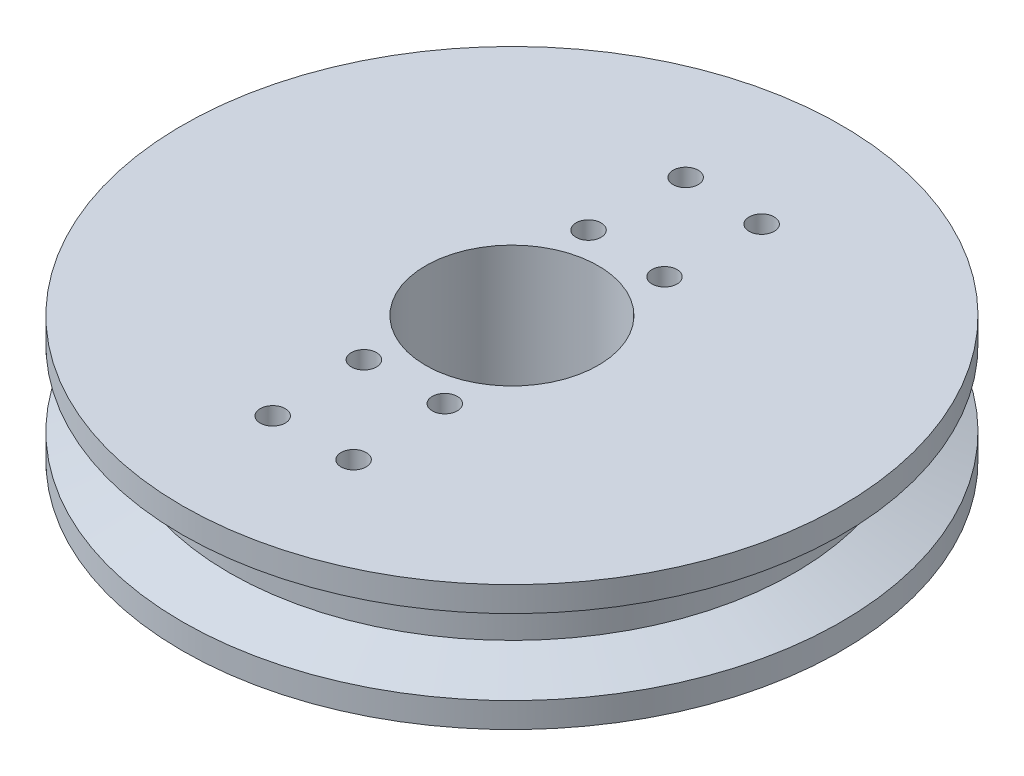
ISO-10303-21;
HEADER;
FILE_DESCRIPTION(('STEP AP214'),'2;1');
FILE_NAME('part.step','',(''),(''),'','','');
FILE_SCHEMA(('AUTOMOTIVE_DESIGN { 1 0 10303 214 1 1 1 1 }'));
ENDSEC;
DATA;
#1=APPLICATION_CONTEXT('core data for automotive mechanical design processes');
#2=APPLICATION_PROTOCOL_DEFINITION('international standard','automotive_design',2000,#1);
#3=PRODUCT_CONTEXT('',#1,'mechanical');
#4=PRODUCT('Part','Part','',(#3));
#5=PRODUCT_RELATED_PRODUCT_CATEGORY('part','',(#4));
#6=PRODUCT_DEFINITION_FORMATION('','',#4);
#7=PRODUCT_DEFINITION_CONTEXT('part definition',#1,'design');
#8=PRODUCT_DEFINITION('design','',#6,#7);
#9=PRODUCT_DEFINITION_SHAPE('','',#8);
#10=(LENGTH_UNIT() NAMED_UNIT(*) SI_UNIT(.MILLI.,.METRE.));
#11=(NAMED_UNIT(*) PLANE_ANGLE_UNIT() SI_UNIT($,.RADIAN.));
#12=(NAMED_UNIT(*) SI_UNIT($,.STERADIAN.) SOLID_ANGLE_UNIT());
#13=UNCERTAINTY_MEASURE_WITH_UNIT(LENGTH_MEASURE(1.E-05),#10,'distance_accuracy_value','');
#14=(GEOMETRIC_REPRESENTATION_CONTEXT(3) GLOBAL_UNCERTAINTY_ASSIGNED_CONTEXT((#13)) GLOBAL_UNIT_ASSIGNED_CONTEXT((#10,
#11,#12)) REPRESENTATION_CONTEXT('',''));
#15=CARTESIAN_POINT('',(0.,0.,0.));
#16=DIRECTION('',(0.,0.,1.));
#17=DIRECTION('',(1.,0.,0.));
#18=AXIS2_PLACEMENT_3D('',#15,#16,#17);
#19=CARTESIAN_POINT('',(105.,-1.48189165001909,0.));
#20=DIRECTION('',(0.,-1.,0.));
#21=DIRECTION('',(0.,0.,-1.));
#22=AXIS2_PLACEMENT_3D('',#19,#20,#21);
#23=PLANE('',#22);
#24=CARTESIAN_POINT('',(-10.4350682088735,-1.48189165001909,-65.7866712355736));
#25=DIRECTION('',(0.,-1.,0.));
#26=DIRECTION('',(0.,0.,-1.));
#27=AXIS2_PLACEMENT_3D('',#24,#25,#26);
#28=CIRCLE('',#27,4.00000000000001);
#29=CARTESIAN_POINT('',(-10.4350682088735,-1.48189165001909,-69.7866712355736));
#30=VERTEX_POINT('',#29);
#31=EDGE_CURVE('E101',#30,#30,#28,.T.);
#32=ORIENTED_EDGE('',*,*,#31,.T.);
#33=EDGE_LOOP('',(#32));
#34=FACE_BOUND('',#33,.T.);
#35=CARTESIAN_POINT('',(14.5525516931324,-1.48189165001909,-65.));
#36=DIRECTION('',(0.,-1.,0.));
#37=DIRECTION('',(0.,0.,-1.));
#38=AXIS2_PLACEMENT_3D('',#35,#36,#37);
#39=CIRCLE('',#38,3.99999999999999);
#40=CARTESIAN_POINT('',(14.5525516931324,-1.48189165001909,-69.));
#41=VERTEX_POINT('',#40);
#42=EDGE_CURVE('E107',#41,#41,#39,.T.);
#43=ORIENTED_EDGE('',*,*,#42,.T.);
#44=EDGE_LOOP('',(#43));
#45=FACE_BOUND('',#44,.T.);
#46=CARTESIAN_POINT('',(13.6080785036185,-1.48189165001909,-35.));
#47=DIRECTION('',(0.,-1.,0.));
#48=DIRECTION('',(0.,0.,-1.));
#49=AXIS2_PLACEMENT_3D('',#46,#47,#48);
#50=CIRCLE('',#49,3.99999999999999);
#51=CARTESIAN_POINT('',(13.6080785036185,-1.48189165001909,-39.));
#52=VERTEX_POINT('',#51);
#53=EDGE_CURVE('E113',#52,#52,#50,.T.);
#54=ORIENTED_EDGE('',*,*,#53,.T.);
#55=EDGE_LOOP('',(#54));
#56=FACE_BOUND('',#55,.T.);
#57=CARTESIAN_POINT('',(-11.3795413983874,-1.48189165001909,-35.7866712355736));
#58=DIRECTION('',(0.,-1.,0.));
#59=DIRECTION('',(0.,0.,-1.));
#60=AXIS2_PLACEMENT_3D('',#57,#58,#59);
#61=CIRCLE('',#60,4.);
#62=CARTESIAN_POINT('',(-11.3795413983874,-1.48189165001909,-39.7866712355736));
#63=VERTEX_POINT('',#62);
#64=EDGE_CURVE('E95',#63,#63,#61,.T.);
#65=ORIENTED_EDGE('',*,*,#64,.T.);
#66=EDGE_LOOP('',(#65));
#67=FACE_BOUND('',#66,.T.);
#68=CARTESIAN_POINT('',(-10.4350682088735,-1.48189165001909,65.7866712355736));
#69=DIRECTION('',(0.,1.,0.));
#70=DIRECTION('',(0.,0.,1.));
#71=AXIS2_PLACEMENT_3D('',#68,#69,#70);
#72=CIRCLE('',#71,4.00000000000001);
#73=CARTESIAN_POINT('',(-10.4350682088735,-1.48189165001909,69.7866712355736));
#74=VERTEX_POINT('',#73);
#75=EDGE_CURVE('E77',#74,#74,#72,.T.);
#76=ORIENTED_EDGE('',*,*,#75,.F.);
#77=EDGE_LOOP('',(#76));
#78=FACE_BOUND('',#77,.T.);
#79=CARTESIAN_POINT('',(14.5525516931324,-1.48189165001909,65.));
#80=DIRECTION('',(0.,1.,0.));
#81=DIRECTION('',(0.,0.,1.));
#82=AXIS2_PLACEMENT_3D('',#79,#80,#81);
#83=CIRCLE('',#82,3.99999999999999);
#84=CARTESIAN_POINT('',(14.5525516931324,-1.48189165001909,69.));
#85=VERTEX_POINT('',#84);
#86=EDGE_CURVE('E84',#85,#85,#83,.T.);
#87=ORIENTED_EDGE('',*,*,#86,.F.);
#88=EDGE_LOOP('',(#87));
#89=FACE_BOUND('',#88,.T.);
#90=CARTESIAN_POINT('',(13.6080785036185,-1.48189165001909,35.));
#91=DIRECTION('',(0.,1.,0.));
#92=DIRECTION('',(0.,0.,1.));
#93=AXIS2_PLACEMENT_3D('',#90,#91,#92);
#94=CIRCLE('',#93,3.99999999999999);
#95=CARTESIAN_POINT('',(13.6080785036185,-1.48189165001909,39.));
#96=VERTEX_POINT('',#95);
#97=EDGE_CURVE('E90',#96,#96,#94,.T.);
#98=ORIENTED_EDGE('',*,*,#97,.F.);
#99=EDGE_LOOP('',(#98));
#100=FACE_BOUND('',#99,.T.);
#101=CARTESIAN_POINT('',(-11.3795413983874,-1.48189165001909,35.7866712355736));
#102=DIRECTION('',(0.,1.,0.));
#103=DIRECTION('',(0.,0.,1.));
#104=AXIS2_PLACEMENT_3D('',#101,#102,#103);
#105=CIRCLE('',#104,4.);
#106=CARTESIAN_POINT('',(-11.3795413983874,-1.48189165001909,39.7866712355736));
#107=VERTEX_POINT('',#106);
#108=EDGE_CURVE('E71',#107,#107,#105,.T.);
#109=ORIENTED_EDGE('',*,*,#108,.F.);
#110=EDGE_LOOP('',(#109));
#111=FACE_BOUND('',#110,.T.);
#112=CARTESIAN_POINT('',(0.,-1.48189165001909,0.));
#113=DIRECTION('',(0.,1.,0.));
#114=DIRECTION('',(0.,0.,1.));
#115=AXIS2_PLACEMENT_3D('',#112,#113,#114);
#116=CIRCLE('',#115,27.5);
#117=CARTESIAN_POINT('',(0.,-1.48189165001909,27.5));
#118=VERTEX_POINT('',#117);
#119=EDGE_CURVE('E10',#118,#118,#116,.T.);
#120=ORIENTED_EDGE('',*,*,#119,.F.);
#121=EDGE_LOOP('',(#120));
#122=FACE_BOUND('',#121,.T.);
#123=CARTESIAN_POINT('',(0.,-1.48189165001908,0.));
#124=DIRECTION('',(0.,1.,0.));
#125=DIRECTION('',(0.,0.,1.));
#126=AXIS2_PLACEMENT_3D('',#123,#124,#125);
#127=CIRCLE('',#126,105.);
#128=CARTESIAN_POINT('',(0.,-1.48189165001908,105.));
#129=VERTEX_POINT('',#128);
#130=EDGE_CURVE('E67',#129,#129,#127,.T.);
#131=ORIENTED_EDGE('',*,*,#130,.T.);
#132=EDGE_LOOP('',(#131));
#133=FACE_BOUND('',#132,.T.);
#134=ADVANCED_FACE('F39',(#34,#45,#56,#67,#78,#89,#100,#111,#122,#133),#23,.F.);
#135=CARTESIAN_POINT('',(0.,0.,0.));
#136=DIRECTION('',(0.,1.,0.));
#137=DIRECTION('',(0.,0.,1.));
#138=AXIS2_PLACEMENT_3D('',#135,#136,#137);
#139=CYLINDRICAL_SURFACE('',#138,27.5);
#140=CARTESIAN_POINT('',(0.,-41.4818916500191,0.));
#141=DIRECTION('',(0.,1.,0.));
#142=DIRECTION('',(0.,0.,1.));
#143=AXIS2_PLACEMENT_3D('',#140,#141,#142);
#144=CIRCLE('',#143,27.5);
#145=CARTESIAN_POINT('',(0.,-41.4818916500191,27.5));
#146=VERTEX_POINT('',#145);
#147=EDGE_CURVE('E45',#146,#146,#144,.T.);
#148=ORIENTED_EDGE('',*,*,#147,.F.);
#149=EDGE_LOOP('',(#148));
#150=FACE_BOUND('',#149,.T.);
#151=ORIENTED_EDGE('',*,*,#119,.T.);
#152=EDGE_LOOP('',(#151));
#153=FACE_BOUND('',#152,.T.);
#154=ADVANCED_FACE('F126',(#150,#153),#139,.F.);
#155=CARTESIAN_POINT('',(105.,-41.4818916500191,0.));
#156=DIRECTION('',(0.,1.,0.));
#157=DIRECTION('',(0.,0.,1.));
#158=AXIS2_PLACEMENT_3D('',#155,#156,#157);
#159=PLANE('',#158);
#160=CARTESIAN_POINT('',(-10.4350682088735,-41.4818916500191,-65.7866712355736));
#161=DIRECTION('',(0.,-1.,0.));
#162=DIRECTION('',(0.,0.,-1.));
#163=AXIS2_PLACEMENT_3D('',#160,#161,#162);
#164=CIRCLE('',#163,4.00000000000001);
#165=CARTESIAN_POINT('',(-10.4350682088735,-41.4818916500191,-69.7866712355736));
#166=VERTEX_POINT('',#165);
#167=EDGE_CURVE('E104',#166,#166,#164,.T.);
#168=ORIENTED_EDGE('',*,*,#167,.F.);
#169=EDGE_LOOP('',(#168));
#170=FACE_BOUND('',#169,.T.);
#171=CARTESIAN_POINT('',(14.5525516931324,-41.4818916500191,-65.));
#172=DIRECTION('',(0.,-1.,0.));
#173=DIRECTION('',(0.,0.,-1.));
#174=AXIS2_PLACEMENT_3D('',#171,#172,#173);
#175=CIRCLE('',#174,3.99999999999999);
#176=CARTESIAN_POINT('',(14.5525516931324,-41.4818916500191,-69.));
#177=VERTEX_POINT('',#176);
#178=EDGE_CURVE('E110',#177,#177,#175,.T.);
#179=ORIENTED_EDGE('',*,*,#178,.F.);
#180=EDGE_LOOP('',(#179));
#181=FACE_BOUND('',#180,.T.);
#182=CARTESIAN_POINT('',(13.6080785036185,-41.4818916500191,-35.));
#183=DIRECTION('',(0.,-1.,0.));
#184=DIRECTION('',(0.,0.,-1.));
#185=AXIS2_PLACEMENT_3D('',#182,#183,#184);
#186=CIRCLE('',#185,3.99999999999999);
#187=CARTESIAN_POINT('',(13.6080785036185,-41.4818916500191,-39.));
#188=VERTEX_POINT('',#187);
#189=EDGE_CURVE('E98',#188,#188,#186,.T.);
#190=ORIENTED_EDGE('',*,*,#189,.F.);
#191=EDGE_LOOP('',(#190));
#192=FACE_BOUND('',#191,.T.);
#193=CARTESIAN_POINT('',(-11.3795413983874,-41.4818916500191,-35.7866712355736));
#194=DIRECTION('',(0.,-1.,0.));
#195=DIRECTION('',(0.,0.,-1.));
#196=AXIS2_PLACEMENT_3D('',#193,#194,#195);
#197=CIRCLE('',#196,4.);
#198=CARTESIAN_POINT('',(-11.3795413983874,-41.4818916500191,-39.7866712355736));
#199=VERTEX_POINT('',#198);
#200=EDGE_CURVE('E81',#199,#199,#197,.T.);
#201=ORIENTED_EDGE('',*,*,#200,.F.);
#202=EDGE_LOOP('',(#201));
#203=FACE_BOUND('',#202,.T.);
#204=CARTESIAN_POINT('',(-10.4350682088735,-41.4818916500191,65.7866712355736));
#205=DIRECTION('',(0.,1.,0.));
#206=DIRECTION('',(0.,0.,1.));
#207=AXIS2_PLACEMENT_3D('',#204,#205,#206);
#208=CIRCLE('',#207,4.00000000000001);
#209=CARTESIAN_POINT('',(-10.4350682088735,-41.4818916500191,69.7866712355736));
#210=VERTEX_POINT('',#209);
#211=EDGE_CURVE('E80',#210,#210,#208,.T.);
#212=ORIENTED_EDGE('',*,*,#211,.T.);
#213=EDGE_LOOP('',(#212));
#214=FACE_BOUND('',#213,.T.);
#215=CARTESIAN_POINT('',(14.5525516931324,-41.4818916500191,65.));
#216=DIRECTION('',(0.,1.,0.));
#217=DIRECTION('',(0.,0.,1.));
#218=AXIS2_PLACEMENT_3D('',#215,#216,#217);
#219=CIRCLE('',#218,3.99999999999999);
#220=CARTESIAN_POINT('',(14.5525516931324,-41.4818916500191,69.));
#221=VERTEX_POINT('',#220);
#222=EDGE_CURVE('E87',#221,#221,#219,.T.);
#223=ORIENTED_EDGE('',*,*,#222,.T.);
#224=EDGE_LOOP('',(#223));
#225=FACE_BOUND('',#224,.T.);
#226=CARTESIAN_POINT('',(13.6080785036185,-41.4818916500191,35.));
#227=DIRECTION('',(0.,1.,0.));
#228=DIRECTION('',(0.,0.,1.));
#229=AXIS2_PLACEMENT_3D('',#226,#227,#228);
#230=CIRCLE('',#229,3.99999999999999);
#231=CARTESIAN_POINT('',(13.6080785036185,-41.4818916500191,39.));
#232=VERTEX_POINT('',#231);
#233=EDGE_CURVE('E74',#232,#232,#230,.T.);
#234=ORIENTED_EDGE('',*,*,#233,.T.);
#235=EDGE_LOOP('',(#234));
#236=FACE_BOUND('',#235,.T.);
#237=CARTESIAN_POINT('',(-11.3795413983874,-41.4818916500191,35.7866712355736));
#238=DIRECTION('',(0.,1.,0.));
#239=DIRECTION('',(0.,0.,1.));
#240=AXIS2_PLACEMENT_3D('',#237,#238,#239);
#241=CIRCLE('',#240,4.);
#242=CARTESIAN_POINT('',(-11.3795413983874,-41.4818916500191,39.7866712355736));
#243=VERTEX_POINT('',#242);
#244=EDGE_CURVE('E70',#243,#243,#241,.T.);
#245=ORIENTED_EDGE('',*,*,#244,.T.);
#246=EDGE_LOOP('',(#245));
#247=FACE_BOUND('',#246,.T.);
#248=CARTESIAN_POINT('',(0.,-41.4818916500191,0.));
#249=DIRECTION('',(0.,1.,0.));
#250=DIRECTION('',(0.,0.,1.));
#251=AXIS2_PLACEMENT_3D('',#248,#249,#250);
#252=CIRCLE('',#251,105.);
#253=CARTESIAN_POINT('',(0.,-41.4818916500191,105.));
#254=VERTEX_POINT('',#253);
#255=EDGE_CURVE('E49',#254,#254,#252,.T.);
#256=ORIENTED_EDGE('',*,*,#255,.F.);
#257=EDGE_LOOP('',(#256));
#258=FACE_BOUND('',#257,.T.);
#259=ORIENTED_EDGE('',*,*,#147,.T.);
#260=EDGE_LOOP('',(#259));
#261=FACE_BOUND('',#260,.T.);
#262=ADVANCED_FACE('F122',(#170,#181,#192,#203,#214,#225,#236,#247,#258,#261),#159,.F.);
#263=CARTESIAN_POINT('',(0.,0.,0.));
#264=DIRECTION('',(0.,1.,0.));
#265=DIRECTION('',(0.,0.,1.));
#266=AXIS2_PLACEMENT_3D('',#263,#264,#265);
#267=CYLINDRICAL_SURFACE('',#266,105.);
#268=CARTESIAN_POINT('',(0.,-33.4818916500191,0.));
#269=DIRECTION('',(0.,1.,0.));
#270=DIRECTION('',(0.,0.,1.));
#271=AXIS2_PLACEMENT_3D('',#268,#269,#270);
#272=CIRCLE('',#271,105.);
#273=CARTESIAN_POINT('',(0.,-33.4818916500191,105.));
#274=VERTEX_POINT('',#273);
#275=EDGE_CURVE('E53',#274,#274,#272,.T.);
#276=ORIENTED_EDGE('',*,*,#275,.F.);
#277=EDGE_LOOP('',(#276));
#278=FACE_BOUND('',#277,.T.);
#279=ORIENTED_EDGE('',*,*,#255,.T.);
#280=EDGE_LOOP('',(#279));
#281=FACE_BOUND('',#280,.T.);
#282=ADVANCED_FACE('F125',(#278,#281),#267,.T.);
#283=CARTESIAN_POINT('',(0.,-33.4818916500191,0.));
#284=DIRECTION('',(0.,-1.,0.));
#285=DIRECTION('',(0.,0.,-1.));
#286=AXIS2_PLACEMENT_3D('',#283,#284,#285);
#287=CONICAL_SURFACE('',#286,105.,1.19028994968253);
#288=CARTESIAN_POINT('',(0.,-27.4818916500191,0.));
#289=DIRECTION('',(0.,1.,0.));
#290=DIRECTION('',(0.,0.,1.));
#291=AXIS2_PLACEMENT_3D('',#288,#289,#290);
#292=CIRCLE('',#291,90.);
#293=CARTESIAN_POINT('',(0.,-27.4818916500191,90.));
#294=VERTEX_POINT('',#293);
#295=EDGE_CURVE('E58',#294,#294,#292,.T.);
#296=ORIENTED_EDGE('',*,*,#295,.F.);
#297=EDGE_LOOP('',(#296));
#298=FACE_BOUND('',#297,.T.);
#299=ORIENTED_EDGE('',*,*,#275,.T.);
#300=EDGE_LOOP('',(#299));
#301=FACE_BOUND('',#300,.T.);
#302=ADVANCED_FACE('F142',(#298,#301),#287,.T.);
#303=CARTESIAN_POINT('',(0.,0.,0.));
#304=DIRECTION('',(0.,1.,0.));
#305=DIRECTION('',(0.,0.,1.));
#306=AXIS2_PLACEMENT_3D('',#303,#304,#305);
#307=CYLINDRICAL_SURFACE('',#306,90.);
#308=CARTESIAN_POINT('',(0.,-15.4818916500191,0.));
#309=DIRECTION('',(0.,1.,0.));
#310=DIRECTION('',(0.,0.,1.));
#311=AXIS2_PLACEMENT_3D('',#308,#309,#310);
#312=CIRCLE('',#311,90.);
#313=CARTESIAN_POINT('',(0.,-15.4818916500191,90.));
#314=VERTEX_POINT('',#313);
#315=EDGE_CURVE('E61',#314,#314,#312,.T.);
#316=ORIENTED_EDGE('',*,*,#315,.F.);
#317=EDGE_LOOP('',(#316));
#318=FACE_BOUND('',#317,.T.);
#319=ORIENTED_EDGE('',*,*,#295,.T.);
#320=EDGE_LOOP('',(#319));
#321=FACE_BOUND('',#320,.T.);
#322=ADVANCED_FACE('F149',(#318,#321),#307,.T.);
#323=CARTESIAN_POINT('',(0.,-15.4818916500191,0.));
#324=DIRECTION('',(0.,1.,0.));
#325=DIRECTION('',(0.,0.,1.));
#326=AXIS2_PLACEMENT_3D('',#323,#324,#325);
#327=CONICAL_SURFACE('',#326,90.,1.19028994968253);
#328=CARTESIAN_POINT('',(0.,-9.48189165001908,0.));
#329=DIRECTION('',(0.,1.,0.));
#330=DIRECTION('',(0.,0.,1.));
#331=AXIS2_PLACEMENT_3D('',#328,#329,#330);
#332=CIRCLE('',#331,105.);
#333=CARTESIAN_POINT('',(0.,-9.48189165001908,105.));
#334=VERTEX_POINT('',#333);
#335=EDGE_CURVE('E64',#334,#334,#332,.T.);
#336=ORIENTED_EDGE('',*,*,#335,.F.);
#337=EDGE_LOOP('',(#336));
#338=FACE_BOUND('',#337,.T.);
#339=ORIENTED_EDGE('',*,*,#315,.T.);
#340=EDGE_LOOP('',(#339));
#341=FACE_BOUND('',#340,.T.);
#342=ADVANCED_FACE('F182',(#338,#341),#327,.T.);
#343=CARTESIAN_POINT('',(0.,0.,0.));
#344=DIRECTION('',(0.,1.,0.));
#345=DIRECTION('',(0.,0.,1.));
#346=AXIS2_PLACEMENT_3D('',#343,#344,#345);
#347=CYLINDRICAL_SURFACE('',#346,105.);
#348=ORIENTED_EDGE('',*,*,#130,.F.);
#349=EDGE_LOOP('',(#348));
#350=FACE_BOUND('',#349,.T.);
#351=ORIENTED_EDGE('',*,*,#335,.T.);
#352=EDGE_LOOP('',(#351));
#353=FACE_BOUND('',#352,.T.);
#354=ADVANCED_FACE('F178',(#350,#353),#347,.T.);
#355=CARTESIAN_POINT('',(-11.3795413983874,-41.4818916500191,35.7866712355736));
#356=DIRECTION('',(0.,1.,0.));
#357=DIRECTION('',(0.,0.,1.));
#358=AXIS2_PLACEMENT_3D('',#355,#356,#357);
#359=CYLINDRICAL_SURFACE('',#358,4.);
#360=ORIENTED_EDGE('',*,*,#244,.F.);
#361=EDGE_LOOP('',(#360));
#362=FACE_BOUND('',#361,.T.);
#363=ORIENTED_EDGE('',*,*,#108,.T.);
#364=EDGE_LOOP('',(#363));
#365=FACE_BOUND('',#364,.T.);
#366=ADVANCED_FACE('F181',(#362,#365),#359,.F.);
#367=CARTESIAN_POINT('',(13.6080785036185,-41.4818916500191,35.));
#368=DIRECTION('',(0.,1.,0.));
#369=DIRECTION('',(0.,0.,1.));
#370=AXIS2_PLACEMENT_3D('',#367,#368,#369);
#371=CYLINDRICAL_SURFACE('',#370,3.99999999999999);
#372=ORIENTED_EDGE('',*,*,#233,.F.);
#373=EDGE_LOOP('',(#372));
#374=FACE_BOUND('',#373,.T.);
#375=ORIENTED_EDGE('',*,*,#97,.T.);
#376=EDGE_LOOP('',(#375));
#377=FACE_BOUND('',#376,.T.);
#378=ADVANCED_FACE('F201',(#374,#377),#371,.F.);
#379=CARTESIAN_POINT('',(14.5525516931324,-41.4818916500191,65.));
#380=DIRECTION('',(0.,1.,0.));
#381=DIRECTION('',(0.,0.,1.));
#382=AXIS2_PLACEMENT_3D('',#379,#380,#381);
#383=CYLINDRICAL_SURFACE('',#382,3.99999999999999);
#384=ORIENTED_EDGE('',*,*,#222,.F.);
#385=EDGE_LOOP('',(#384));
#386=FACE_BOUND('',#385,.T.);
#387=ORIENTED_EDGE('',*,*,#86,.T.);
#388=EDGE_LOOP('',(#387));
#389=FACE_BOUND('',#388,.T.);
#390=ADVANCED_FACE('F206',(#386,#389),#383,.F.);
#391=CARTESIAN_POINT('',(-10.4350682088735,-41.4818916500191,65.7866712355736));
#392=DIRECTION('',(0.,1.,0.));
#393=DIRECTION('',(0.,0.,1.));
#394=AXIS2_PLACEMENT_3D('',#391,#392,#393);
#395=CYLINDRICAL_SURFACE('',#394,4.00000000000001);
#396=ORIENTED_EDGE('',*,*,#211,.F.);
#397=EDGE_LOOP('',(#396));
#398=FACE_BOUND('',#397,.T.);
#399=ORIENTED_EDGE('',*,*,#75,.T.);
#400=EDGE_LOOP('',(#399));
#401=FACE_BOUND('',#400,.T.);
#402=ADVANCED_FACE('F203',(#398,#401),#395,.F.);
#403=CARTESIAN_POINT('',(-11.3795413983874,-41.4818916500191,-35.7866712355736));
#404=DIRECTION('',(0.,1.,0.));
#405=DIRECTION('',(0.,0.,1.));
#406=AXIS2_PLACEMENT_3D('',#403,#404,#405);
#407=CYLINDRICAL_SURFACE('',#406,4.);
#408=ORIENTED_EDGE('',*,*,#200,.T.);
#409=EDGE_LOOP('',(#408));
#410=FACE_BOUND('',#409,.T.);
#411=ORIENTED_EDGE('',*,*,#64,.F.);
#412=EDGE_LOOP('',(#411));
#413=FACE_BOUND('',#412,.T.);
#414=ADVANCED_FACE('F205',(#410,#413),#407,.F.);
#415=CARTESIAN_POINT('',(13.6080785036185,-41.4818916500191,-35.));
#416=DIRECTION('',(0.,1.,0.));
#417=DIRECTION('',(0.,0.,1.));
#418=AXIS2_PLACEMENT_3D('',#415,#416,#417);
#419=CYLINDRICAL_SURFACE('',#418,3.99999999999999);
#420=ORIENTED_EDGE('',*,*,#189,.T.);
#421=EDGE_LOOP('',(#420));
#422=FACE_BOUND('',#421,.T.);
#423=ORIENTED_EDGE('',*,*,#53,.F.);
#424=EDGE_LOOP('',(#423));
#425=FACE_BOUND('',#424,.T.);
#426=ADVANCED_FACE('F119',(#422,#425),#419,.F.);
#427=CARTESIAN_POINT('',(14.5525516931324,-41.4818916500191,-65.));
#428=DIRECTION('',(0.,1.,0.));
#429=DIRECTION('',(0.,0.,1.));
#430=AXIS2_PLACEMENT_3D('',#427,#428,#429);
#431=CYLINDRICAL_SURFACE('',#430,3.99999999999999);
#432=ORIENTED_EDGE('',*,*,#178,.T.);
#433=EDGE_LOOP('',(#432));
#434=FACE_BOUND('',#433,.T.);
#435=ORIENTED_EDGE('',*,*,#42,.F.);
#436=EDGE_LOOP('',(#435));
#437=FACE_BOUND('',#436,.T.);
#438=ADVANCED_FACE('F220',(#434,#437),#431,.F.);
#439=CARTESIAN_POINT('',(-10.4350682088735,-41.4818916500191,-65.7866712355736));
#440=DIRECTION('',(0.,1.,0.));
#441=DIRECTION('',(0.,0.,1.));
#442=AXIS2_PLACEMENT_3D('',#439,#440,#441);
#443=CYLINDRICAL_SURFACE('',#442,4.00000000000001);
#444=ORIENTED_EDGE('',*,*,#167,.T.);
#445=EDGE_LOOP('',(#444));
#446=FACE_BOUND('',#445,.T.);
#447=ORIENTED_EDGE('',*,*,#31,.F.);
#448=EDGE_LOOP('',(#447));
#449=FACE_BOUND('',#448,.T.);
#450=ADVANCED_FACE('F217',(#446,#449),#443,.F.);
#451=CLOSED_SHELL('',(#134,#154,#262,#282,#302,#322,#342,#354,#366,#378,#390,#402,#414,#426,
#438,#450));
#452=MANIFOLD_SOLID_BREP('B2',#451);
#453=ADVANCED_BREP_SHAPE_REPRESENTATION('',(#18,#452),#14);
#454=SHAPE_DEFINITION_REPRESENTATION(#9,#453);
ENDSEC;
END-ISO-10303-21;
